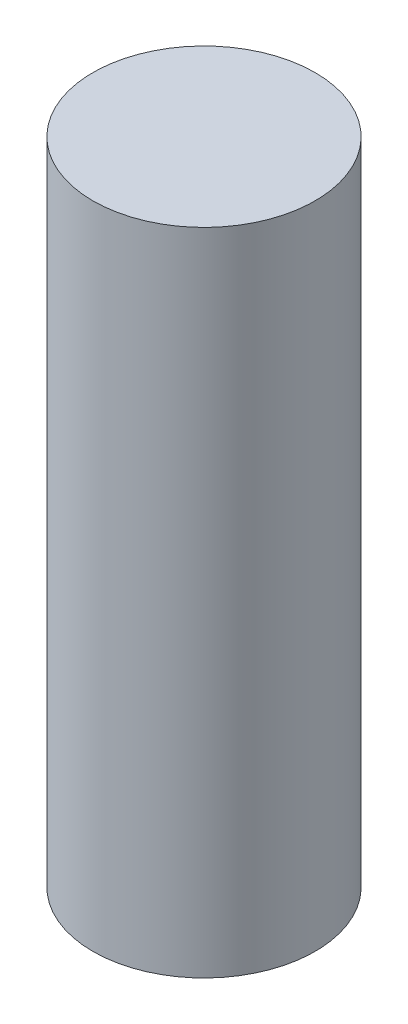
ISO-10303-21;
HEADER;
FILE_DESCRIPTION(('STEP AP214'),'2;1');
FILE_NAME('part.step','',(''),(''),'','','');
FILE_SCHEMA(('AUTOMOTIVE_DESIGN { 1 0 10303 214 1 1 1 1 }'));
ENDSEC;
DATA;
#1=APPLICATION_CONTEXT('core data for automotive mechanical design processes');
#2=APPLICATION_PROTOCOL_DEFINITION('international standard','automotive_design',2000,#1);
#3=PRODUCT_CONTEXT('',#1,'mechanical');
#4=PRODUCT('Part','Part','',(#3));
#5=PRODUCT_RELATED_PRODUCT_CATEGORY('part','',(#4));
#6=PRODUCT_DEFINITION_FORMATION('','',#4);
#7=PRODUCT_DEFINITION_CONTEXT('part definition',#1,'design');
#8=PRODUCT_DEFINITION('design','',#6,#7);
#9=PRODUCT_DEFINITION_SHAPE('','',#8);
#10=(LENGTH_UNIT() NAMED_UNIT(*) SI_UNIT(.MILLI.,.METRE.));
#11=(NAMED_UNIT(*) PLANE_ANGLE_UNIT() SI_UNIT($,.RADIAN.));
#12=(NAMED_UNIT(*) SI_UNIT($,.STERADIAN.) SOLID_ANGLE_UNIT());
#13=UNCERTAINTY_MEASURE_WITH_UNIT(LENGTH_MEASURE(1.E-05),#10,'distance_accuracy_value','');
#14=(GEOMETRIC_REPRESENTATION_CONTEXT(3) GLOBAL_UNCERTAINTY_ASSIGNED_CONTEXT((#13)) GLOBAL_UNIT_ASSIGNED_CONTEXT((#10,
#11,#12)) REPRESENTATION_CONTEXT('',''));
#15=CARTESIAN_POINT('',(0.,0.,0.));
#16=DIRECTION('',(0.,0.,1.));
#17=DIRECTION('',(1.,0.,0.));
#18=AXIS2_PLACEMENT_3D('',#15,#16,#17);
#19=CARTESIAN_POINT('',(0.,117.,0.));
#20=DIRECTION('',(0.,-1.,0.));
#21=DIRECTION('',(0.,0.,-1.));
#22=AXIS2_PLACEMENT_3D('',#19,#20,#21);
#23=CYLINDRICAL_SURFACE('',#22,20.);
#24=CARTESIAN_POINT('',(0.,117.,0.));
#25=DIRECTION('',(0.,1.,0.));
#26=DIRECTION('',(0.,0.,1.));
#27=AXIS2_PLACEMENT_3D('',#24,#25,#26);
#28=CIRCLE('',#27,20.);
#29=CARTESIAN_POINT('',(0.,117.,20.));
#30=VERTEX_POINT('',#29);
#31=EDGE_CURVE('E10',#30,#30,#28,.T.);
#32=ORIENTED_EDGE('',*,*,#31,.F.);
#33=EDGE_LOOP('',(#32));
#34=FACE_BOUND('',#33,.T.);
#35=CARTESIAN_POINT('',(0.,0.,0.));
#36=DIRECTION('',(0.,1.,0.));
#37=DIRECTION('',(0.,0.,1.));
#38=AXIS2_PLACEMENT_3D('',#35,#36,#37);
#39=CIRCLE('',#38,20.);
#40=CARTESIAN_POINT('',(0.,0.,20.));
#41=VERTEX_POINT('',#40);
#42=EDGE_CURVE('E46',#41,#41,#39,.T.);
#43=ORIENTED_EDGE('',*,*,#42,.T.);
#44=EDGE_LOOP('',(#43));
#45=FACE_BOUND('',#44,.T.);
#46=ADVANCED_FACE('F43',(#34,#45),#23,.T.);
#47=CARTESIAN_POINT('',(0.,117.,0.));
#48=DIRECTION('',(0.,1.,0.));
#49=DIRECTION('',(0.,0.,1.));
#50=AXIS2_PLACEMENT_3D('',#47,#48,#49);
#51=PLANE('',#50);
#52=ORIENTED_EDGE('',*,*,#31,.T.);
#53=EDGE_LOOP('',(#52));
#54=FACE_BOUND('',#53,.T.);
#55=ADVANCED_FACE('F60',(#54),#51,.T.);
#56=CARTESIAN_POINT('',(0.,0.,0.));
#57=DIRECTION('',(0.,1.,0.));
#58=DIRECTION('',(0.,0.,1.));
#59=AXIS2_PLACEMENT_3D('',#56,#57,#58);
#60=PLANE('',#59);
#61=ORIENTED_EDGE('',*,*,#42,.F.);
#62=EDGE_LOOP('',(#61));
#63=FACE_BOUND('',#62,.T.);
#64=ADVANCED_FACE('F58',(#63),#60,.F.);
#65=CLOSED_SHELL('',(#46,#55,#64));
#66=MANIFOLD_SOLID_BREP('B2',#65);
#67=ADVANCED_BREP_SHAPE_REPRESENTATION('',(#18,#66),#14);
#68=SHAPE_DEFINITION_REPRESENTATION(#9,#67);
ENDSEC;
END-ISO-10303-21;
